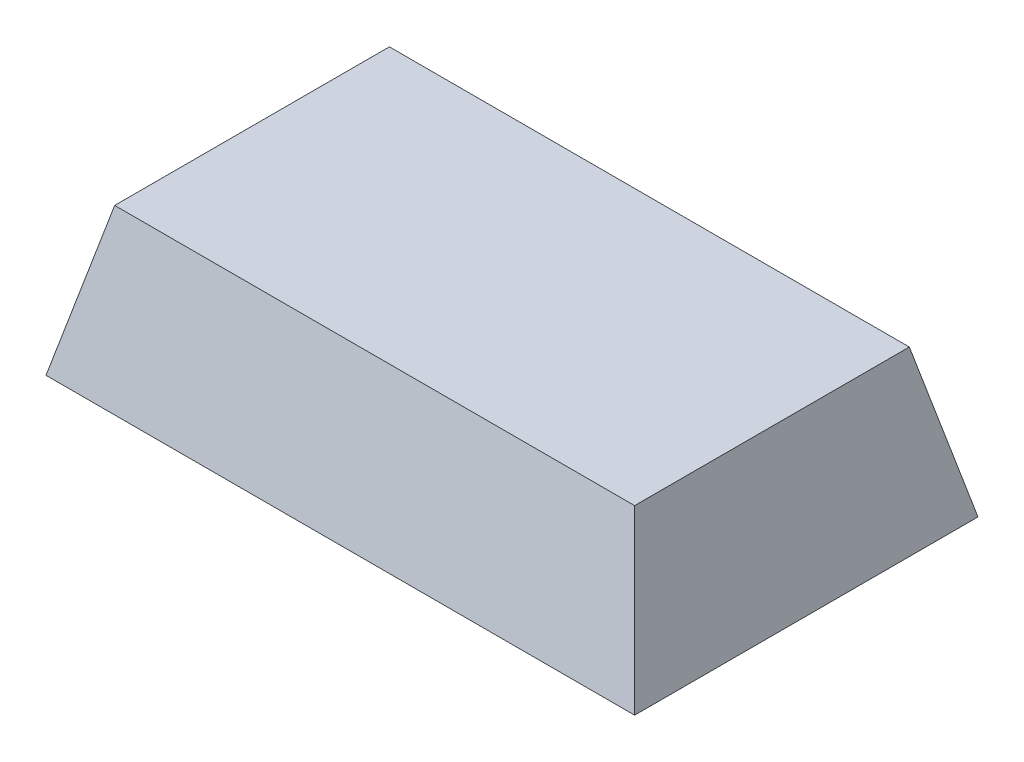
ISO-10303-21;
HEADER;
FILE_DESCRIPTION(('STEP AP214'),'2;1');
FILE_NAME('part.step','',(''),(''),'','','');
FILE_SCHEMA(('AUTOMOTIVE_DESIGN { 1 0 10303 214 1 1 1 1 }'));
ENDSEC;
DATA;
#1=APPLICATION_CONTEXT('core data for automotive mechanical design processes');
#2=APPLICATION_PROTOCOL_DEFINITION('international standard','automotive_design',2000,#1);
#3=PRODUCT_CONTEXT('',#1,'mechanical');
#4=PRODUCT('Part','Part','',(#3));
#5=PRODUCT_RELATED_PRODUCT_CATEGORY('part','',(#4));
#6=PRODUCT_DEFINITION_FORMATION('','',#4);
#7=PRODUCT_DEFINITION_CONTEXT('part definition',#1,'design');
#8=PRODUCT_DEFINITION('design','',#6,#7);
#9=PRODUCT_DEFINITION_SHAPE('','',#8);
#10=(LENGTH_UNIT() NAMED_UNIT(*) SI_UNIT(.MILLI.,.METRE.));
#11=(NAMED_UNIT(*) PLANE_ANGLE_UNIT() SI_UNIT($,.RADIAN.));
#12=(NAMED_UNIT(*) SI_UNIT($,.STERADIAN.) SOLID_ANGLE_UNIT());
#13=UNCERTAINTY_MEASURE_WITH_UNIT(LENGTH_MEASURE(1.E-05),#10,'distance_accuracy_value','');
#14=(GEOMETRIC_REPRESENTATION_CONTEXT(3) GLOBAL_UNCERTAINTY_ASSIGNED_CONTEXT((#13)) GLOBAL_UNIT_ASSIGNED_CONTEXT((#10,
#11,#12)) REPRESENTATION_CONTEXT('',''));
#15=CARTESIAN_POINT('',(0.,0.,0.));
#16=DIRECTION('',(0.,0.,1.));
#17=DIRECTION('',(1.,0.,0.));
#18=AXIS2_PLACEMENT_3D('',#15,#16,#17);
#19=CARTESIAN_POINT('',(0.,3.,0.));
#20=DIRECTION('',(0.,-1.,0.));
#21=DIRECTION('',(0.,0.,-1.));
#22=AXIS2_PLACEMENT_3D('',#19,#20,#21);
#23=PLANE('',#22);
#24=DIRECTION('',(-1.,0.,0.));
#25=VECTOR('',#24,1.);
#26=CARTESIAN_POINT('',(12.,3.,-0.7));
#27=LINE('',#26,#25);
#28=CARTESIAN_POINT('',(11.3,3.,-0.7));
#29=VERTEX_POINT('',#28);
#30=CARTESIAN_POINT('',(0.7,3.,-0.7));
#31=VERTEX_POINT('',#30);
#32=EDGE_CURVE('E60',#29,#31,#27,.T.);
#33=ORIENTED_EDGE('',*,*,#32,.F.);
#34=DIRECTION('',(0.,0.,1.));
#35=VECTOR('',#34,1.);
#36=CARTESIAN_POINT('',(11.3,3.,-7.));
#37=LINE('',#36,#35);
#38=CARTESIAN_POINT('',(11.3,3.,-6.3));
#39=VERTEX_POINT('',#38);
#40=EDGE_CURVE('E117',#39,#29,#37,.T.);
#41=ORIENTED_EDGE('',*,*,#40,.F.);
#42=DIRECTION('',(-1.,0.,0.));
#43=VECTOR('',#42,1.);
#44=CARTESIAN_POINT('',(12.,3.,-6.3));
#45=LINE('',#44,#43);
#46=CARTESIAN_POINT('',(0.700000000000001,3.,-6.3));
#47=VERTEX_POINT('',#46);
#48=EDGE_CURVE('E129',#39,#47,#45,.T.);
#49=ORIENTED_EDGE('',*,*,#48,.T.);
#50=DIRECTION('',(0.,0.,1.));
#51=VECTOR('',#50,1.);
#52=CARTESIAN_POINT('',(0.7,3.,-7.));
#53=LINE('',#52,#51);
#54=EDGE_CURVE('E96',#47,#31,#53,.T.);
#55=ORIENTED_EDGE('',*,*,#54,.T.);
#56=EDGE_LOOP('',(#33,#41,#49,#55));
#57=FACE_BOUND('',#56,.T.);
#58=ADVANCED_FACE('F43',(#57),#23,.F.);
#59=CARTESIAN_POINT('',(12.,0.,-7.));
#60=DIRECTION('',(-0.973841209741793,-0.227229615606418,0.));
#61=DIRECTION('',(0.227229615606418,-0.973841209741793,0.));
#62=AXIS2_PLACEMENT_3D('',#59,#60,#61);
#63=PLANE('',#62);
#64=DIRECTION('',(-0.221581128241521,0.949633406749378,-0.221581128241521));
#65=VECTOR('',#64,1.);
#66=CARTESIAN_POINT('',(11.6563126252505,1.47294589178357,-0.3436873747495));
#67=LINE('',#66,#65);
#68=CARTESIAN_POINT('',(12.,0.,0.));
#69=VERTEX_POINT('',#68);
#70=EDGE_CURVE('E121',#69,#29,#67,.T.);
#71=ORIENTED_EDGE('',*,*,#70,.F.);
#72=DIRECTION('',(0.,0.,-1.));
#73=VECTOR('',#72,1.);
#74=CARTESIAN_POINT('',(12.,0.,0.));
#75=LINE('',#74,#73);
#76=CARTESIAN_POINT('',(12.,0.,-7.));
#77=VERTEX_POINT('',#76);
#78=EDGE_CURVE('E100',#69,#77,#75,.T.);
#79=ORIENTED_EDGE('',*,*,#78,.T.);
#80=DIRECTION('',(0.221581128241521,-0.949633406749378,-0.221581128241521));
#81=VECTOR('',#80,1.);
#82=CARTESIAN_POINT('',(12.,0.,-7.));
#83=LINE('',#82,#81);
#84=EDGE_CURVE('E126',#39,#77,#83,.T.);
#85=ORIENTED_EDGE('',*,*,#84,.F.);
#86=ORIENTED_EDGE('',*,*,#40,.T.);
#87=EDGE_LOOP('',(#71,#79,#85,#86));
#88=FACE_BOUND('',#87,.T.);
#89=ADVANCED_FACE('F159',(#88),#63,.F.);
#90=CARTESIAN_POINT('',(0.,0.,-7.));
#91=DIRECTION('',(0.973841209741793,-0.227229615606418,0.));
#92=DIRECTION('',(0.227229615606418,0.973841209741793,0.));
#93=AXIS2_PLACEMENT_3D('',#90,#91,#92);
#94=PLANE('',#93);
#95=DIRECTION('',(-0.221581128241521,-0.949633406749378,0.221581128241521));
#96=VECTOR('',#95,1.);
#97=CARTESIAN_POINT('',(0.343687374749499,1.47294589178357,-0.3436873747495));
#98=LINE('',#97,#96);
#99=CARTESIAN_POINT('',(-6.E-06,0.,0.));
#100=VERTEX_POINT('',#99);
#101=EDGE_CURVE('E11',#31,#100,#98,.T.);
#102=ORIENTED_EDGE('',*,*,#101,.F.);
#103=ORIENTED_EDGE('',*,*,#54,.F.);
#104=DIRECTION('',(0.221581128241521,0.949633406749378,0.221581128241521));
#105=VECTOR('',#104,1.);
#106=CARTESIAN_POINT('',(0.,0.,-7.));
#107=LINE('',#106,#105);
#108=CARTESIAN_POINT('',(0.,0.,-7.));
#109=VERTEX_POINT('',#108);
#110=EDGE_CURVE('E53',#109,#47,#107,.T.);
#111=ORIENTED_EDGE('',*,*,#110,.F.);
#112=DIRECTION('',(0.,0.,1.));
#113=VECTOR('',#112,1.);
#114=CARTESIAN_POINT('',(0.,0.,0.));
#115=LINE('',#114,#113);
#116=EDGE_CURVE('E92',#109,#100,#115,.T.);
#117=ORIENTED_EDGE('',*,*,#116,.T.);
#118=EDGE_LOOP('',(#102,#103,#111,#117));
#119=FACE_BOUND('',#118,.T.);
#120=ADVANCED_FACE('F93',(#119),#94,.F.);
#121=CARTESIAN_POINT('',(0.,0.,0.));
#122=DIRECTION('',(0.,-1.,0.));
#123=DIRECTION('',(0.,0.,-1.));
#124=AXIS2_PLACEMENT_3D('',#121,#122,#123);
#125=PLANE('',#124);
#126=CARTESIAN_POINT('',(6.,0.,-3.5));
#127=DIRECTION('',(0.,-1.,0.));
#128=DIRECTION('',(0.,0.,-1.));
#129=AXIS2_PLACEMENT_3D('',#126,#127,#128);
#130=CIRCLE('',#129,1.8);
#131=CARTESIAN_POINT('',(6.,0.,-5.3));
#132=VERTEX_POINT('',#131);
#133=EDGE_CURVE('E136',#132,#132,#130,.T.);
#134=ORIENTED_EDGE('',*,*,#133,.F.);
#135=EDGE_LOOP('',(#134));
#136=FACE_BOUND('',#135,.T.);
#137=ORIENTED_EDGE('',*,*,#116,.F.);
#138=DIRECTION('',(-1.,0.,0.));
#139=VECTOR('',#138,1.);
#140=CARTESIAN_POINT('',(0.,0.,-7.));
#141=LINE('',#140,#139);
#142=EDGE_CURVE('E68',#77,#109,#141,.T.);
#143=ORIENTED_EDGE('',*,*,#142,.F.);
#144=ORIENTED_EDGE('',*,*,#78,.F.);
#145=DIRECTION('',(1.,0.,0.));
#146=VECTOR('',#145,1.);
#147=CARTESIAN_POINT('',(0.,0.,0.));
#148=LINE('',#147,#146);
#149=EDGE_CURVE('E86',#100,#69,#148,.T.);
#150=ORIENTED_EDGE('',*,*,#149,.F.);
#151=EDGE_LOOP('',(#137,#143,#144,#150));
#152=FACE_BOUND('',#151,.T.);
#153=ADVANCED_FACE('F45',(#136,#152),#125,.T.);
#154=CARTESIAN_POINT('',(12.,3.,-6.3));
#155=DIRECTION('',(0.,0.227229615606418,-0.973841209741793));
#156=DIRECTION('',(0.,0.973841209741793,0.227229615606418));
#157=AXIS2_PLACEMENT_3D('',#154,#155,#156);
#158=PLANE('',#157);
#159=ORIENTED_EDGE('',*,*,#84,.T.);
#160=ORIENTED_EDGE('',*,*,#142,.T.);
#161=ORIENTED_EDGE('',*,*,#110,.T.);
#162=ORIENTED_EDGE('',*,*,#48,.F.);
#163=EDGE_LOOP('',(#159,#160,#161,#162));
#164=FACE_BOUND('',#163,.T.);
#165=ADVANCED_FACE('F153',(#164),#158,.T.);
#166=CARTESIAN_POINT('',(12.,0.,0.));
#167=DIRECTION('',(0.,0.227229615606418,0.973841209741793));
#168=DIRECTION('',(0.,-0.973841209741793,0.227229615606418));
#169=AXIS2_PLACEMENT_3D('',#166,#167,#168);
#170=PLANE('',#169);
#171=ORIENTED_EDGE('',*,*,#70,.T.);
#172=ORIENTED_EDGE('',*,*,#32,.T.);
#173=ORIENTED_EDGE('',*,*,#101,.T.);
#174=ORIENTED_EDGE('',*,*,#149,.T.);
#175=EDGE_LOOP('',(#171,#172,#173,#174));
#176=FACE_BOUND('',#175,.T.);
#177=ADVANCED_FACE('F84',(#176),#170,.T.);
#178=CARTESIAN_POINT('',(6.,0.8,-3.5));
#179=DIRECTION('',(0.,-1.,0.));
#180=DIRECTION('',(0.,0.,-1.));
#181=AXIS2_PLACEMENT_3D('',#178,#179,#180);
#182=CYLINDRICAL_SURFACE('',#181,1.8);
#183=CARTESIAN_POINT('',(6.,0.8,-3.5));
#184=DIRECTION('',(0.,-1.,0.));
#185=DIRECTION('',(0.,0.,-1.));
#186=AXIS2_PLACEMENT_3D('',#183,#184,#185);
#187=CIRCLE('',#186,1.8);
#188=CARTESIAN_POINT('',(6.,0.8,-5.3));
#189=VERTEX_POINT('',#188);
#190=EDGE_CURVE('E133',#189,#189,#187,.T.);
#191=ORIENTED_EDGE('',*,*,#190,.F.);
#192=EDGE_LOOP('',(#191));
#193=FACE_BOUND('',#192,.T.);
#194=ORIENTED_EDGE('',*,*,#133,.T.);
#195=EDGE_LOOP('',(#194));
#196=FACE_BOUND('',#195,.T.);
#197=ADVANCED_FACE('F146',(#193,#196),#182,.F.);
#198=CARTESIAN_POINT('',(6.,0.8,-3.5));
#199=DIRECTION('',(0.,-1.,0.));
#200=DIRECTION('',(0.,0.,-1.));
#201=AXIS2_PLACEMENT_3D('',#198,#199,#200);
#202=PLANE('',#201);
#203=ORIENTED_EDGE('',*,*,#190,.T.);
#204=EDGE_LOOP('',(#203));
#205=FACE_BOUND('',#204,.T.);
#206=ADVANCED_FACE('F144',(#205),#202,.T.);
#207=CLOSED_SHELL('',(#58,#89,#120,#153,#165,#177,#197,#206));
#208=MANIFOLD_SOLID_BREP('B2',#207);
#209=ADVANCED_BREP_SHAPE_REPRESENTATION('',(#18,#208),#14);
#210=SHAPE_DEFINITION_REPRESENTATION(#9,#209);
ENDSEC;
END-ISO-10303-21;
